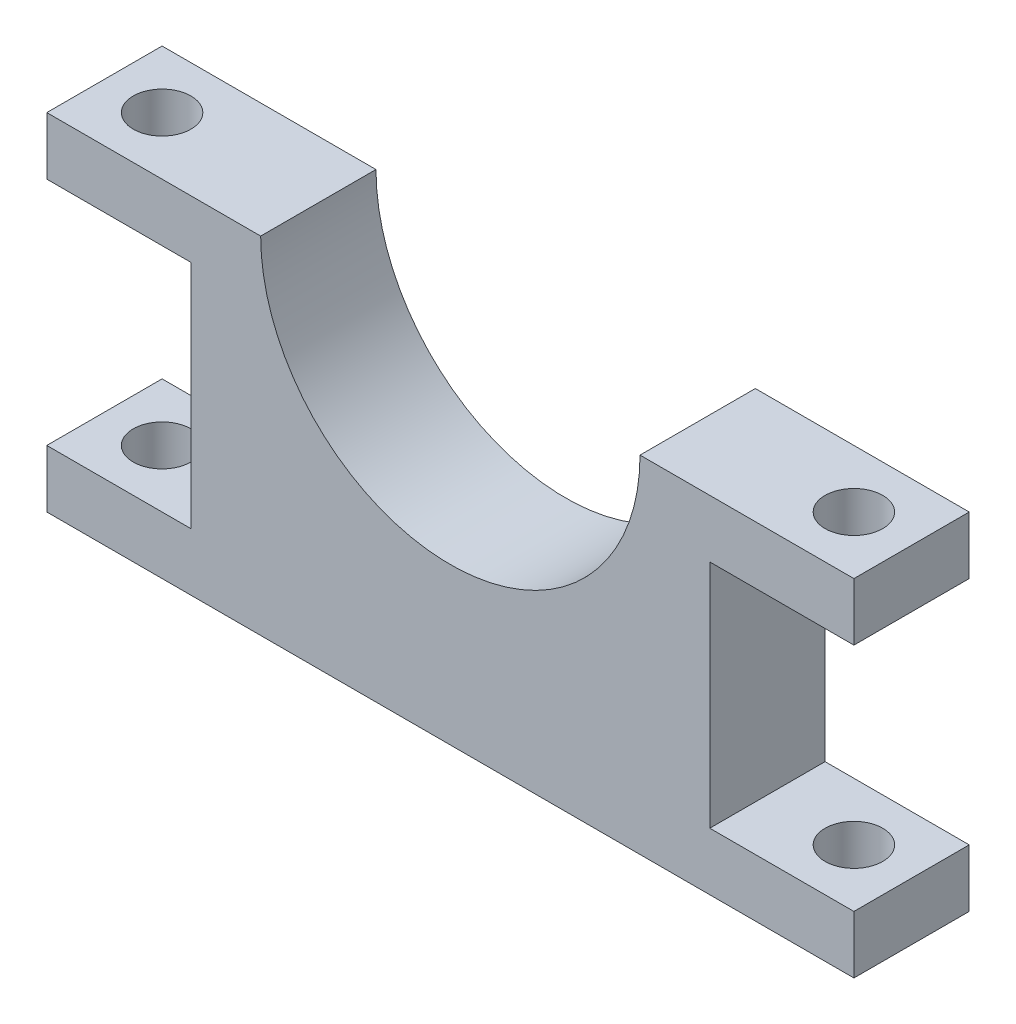
ISO-10303-21;
HEADER;
FILE_DESCRIPTION(('STEP AP214'),'2;1');
FILE_NAME('part.step','',(''),(''),'','','');
FILE_SCHEMA(('AUTOMOTIVE_DESIGN { 1 0 10303 214 1 1 1 1 }'));
ENDSEC;
DATA;
#1=APPLICATION_CONTEXT('core data for automotive mechanical design processes');
#2=APPLICATION_PROTOCOL_DEFINITION('international standard','automotive_design',2000,#1);
#3=PRODUCT_CONTEXT('',#1,'mechanical');
#4=PRODUCT('Part','Part','',(#3));
#5=PRODUCT_RELATED_PRODUCT_CATEGORY('part','',(#4));
#6=PRODUCT_DEFINITION_FORMATION('','',#4);
#7=PRODUCT_DEFINITION_CONTEXT('part definition',#1,'design');
#8=PRODUCT_DEFINITION('design','',#6,#7);
#9=PRODUCT_DEFINITION_SHAPE('','',#8);
#10=(LENGTH_UNIT() NAMED_UNIT(*) SI_UNIT(.MILLI.,.METRE.));
#11=(NAMED_UNIT(*) PLANE_ANGLE_UNIT() SI_UNIT($,.RADIAN.));
#12=(NAMED_UNIT(*) SI_UNIT($,.STERADIAN.) SOLID_ANGLE_UNIT());
#13=UNCERTAINTY_MEASURE_WITH_UNIT(LENGTH_MEASURE(1.E-05),#10,'distance_accuracy_value','');
#14=(GEOMETRIC_REPRESENTATION_CONTEXT(3) GLOBAL_UNCERTAINTY_ASSIGNED_CONTEXT((#13)) GLOBAL_UNIT_ASSIGNED_CONTEXT((#10,
#11,#12)) REPRESENTATION_CONTEXT('',''));
#15=CARTESIAN_POINT('',(0.,0.,0.));
#16=DIRECTION('',(0.,0.,1.));
#17=DIRECTION('',(1.,0.,0.));
#18=AXIS2_PLACEMENT_3D('',#15,#16,#17);
#19=CARTESIAN_POINT('',(-22.5,0.,5.));
#20=DIRECTION('',(1.,0.,0.));
#21=DIRECTION('',(0.,1.,0.));
#22=AXIS2_PLACEMENT_3D('',#19,#20,#21);
#23=PLANE('',#22);
#24=DIRECTION('',(0.,0.,-1.));
#25=VECTOR('',#24,1.);
#26=CARTESIAN_POINT('',(-22.5,-5.,-5.));
#27=LINE('',#26,#25);
#28=CARTESIAN_POINT('',(-22.5,-5.,5.));
#29=VERTEX_POINT('',#28);
#30=CARTESIAN_POINT('',(-22.5,-5.,-5.));
#31=VERTEX_POINT('',#30);
#32=EDGE_CURVE('E162',#29,#31,#27,.T.);
#33=ORIENTED_EDGE('',*,*,#32,.T.);
#34=DIRECTION('',(0.,-1.,0.));
#35=VECTOR('',#34,1.);
#36=CARTESIAN_POINT('',(-22.5,0.,-5.));
#37=LINE('',#36,#35);
#38=CARTESIAN_POINT('',(-22.5,-25.,-5.));
#39=VERTEX_POINT('',#38);
#40=EDGE_CURVE('E307',#31,#39,#37,.T.);
#41=ORIENTED_EDGE('',*,*,#40,.T.);
#42=DIRECTION('',(0.,0.,-1.));
#43=VECTOR('',#42,1.);
#44=CARTESIAN_POINT('',(-22.5,-25.,5.));
#45=LINE('',#44,#43);
#46=CARTESIAN_POINT('',(-22.5,-25.,5.));
#47=VERTEX_POINT('',#46);
#48=EDGE_CURVE('E279',#47,#39,#45,.T.);
#49=ORIENTED_EDGE('',*,*,#48,.F.);
#50=DIRECTION('',(0.,-1.,0.));
#51=VECTOR('',#50,1.);
#52=CARTESIAN_POINT('',(-22.5,0.,5.));
#53=LINE('',#52,#51);
#54=EDGE_CURVE('E55',#29,#47,#53,.T.);
#55=ORIENTED_EDGE('',*,*,#54,.F.);
#56=EDGE_LOOP('',(#33,#41,#49,#55));
#57=FACE_BOUND('',#56,.T.);
#58=ADVANCED_FACE('F39',(#57),#23,.F.);
#59=CARTESIAN_POINT('',(22.5,0.,5.));
#60=DIRECTION('',(-1.,0.,0.));
#61=DIRECTION('',(0.,-1.,0.));
#62=AXIS2_PLACEMENT_3D('',#59,#60,#61);
#63=PLANE('',#62);
#64=DIRECTION('',(0.,1.,0.));
#65=VECTOR('',#64,1.);
#66=CARTESIAN_POINT('',(22.5,0.,-5.));
#67=LINE('',#66,#65);
#68=CARTESIAN_POINT('',(22.5,-25.,-5.));
#69=VERTEX_POINT('',#68);
#70=CARTESIAN_POINT('',(22.5,-4.99999999999999,-5.));
#71=VERTEX_POINT('',#70);
#72=EDGE_CURVE('E313',#69,#71,#67,.T.);
#73=ORIENTED_EDGE('',*,*,#72,.T.);
#74=DIRECTION('',(0.,0.,1.));
#75=VECTOR('',#74,1.);
#76=CARTESIAN_POINT('',(22.5,-5.,-5.));
#77=LINE('',#76,#75);
#78=CARTESIAN_POINT('',(22.5,-4.99999999999999,5.));
#79=VERTEX_POINT('',#78);
#80=EDGE_CURVE('E63',#71,#79,#77,.T.);
#81=ORIENTED_EDGE('',*,*,#80,.T.);
#82=DIRECTION('',(0.,1.,0.));
#83=VECTOR('',#82,1.);
#84=CARTESIAN_POINT('',(22.5,0.,5.));
#85=LINE('',#84,#83);
#86=CARTESIAN_POINT('',(22.5,-25.,5.));
#87=VERTEX_POINT('',#86);
#88=EDGE_CURVE('E295',#87,#79,#85,.T.);
#89=ORIENTED_EDGE('',*,*,#88,.F.);
#90=DIRECTION('',(0.,0.,1.));
#91=VECTOR('',#90,1.);
#92=CARTESIAN_POINT('',(22.5,-25.,5.));
#93=LINE('',#92,#91);
#94=EDGE_CURVE('E264',#69,#87,#93,.T.);
#95=ORIENTED_EDGE('',*,*,#94,.F.);
#96=EDGE_LOOP('',(#73,#81,#89,#95));
#97=FACE_BOUND('',#96,.T.);
#98=ADVANCED_FACE('F342',(#97),#63,.F.);
#99=CARTESIAN_POINT('',(0.,0.,5.));
#100=DIRECTION('',(0.,0.,-1.));
#101=DIRECTION('',(-1.,0.,0.));
#102=AXIS2_PLACEMENT_3D('',#99,#100,#101);
#103=CYLINDRICAL_SURFACE('',#102,16.45);
#104=CARTESIAN_POINT('',(0.,0.,-5.));
#105=DIRECTION('',(0.,0.,-1.));
#106=DIRECTION('',(1.,0.,0.));
#107=AXIS2_PLACEMENT_3D('',#104,#105,#106);
#108=CIRCLE('',#107,16.45);
#109=CARTESIAN_POINT('',(16.45,0.,-5.));
#110=VERTEX_POINT('',#109);
#111=CARTESIAN_POINT('',(-16.45,0.,-5.));
#112=VERTEX_POINT('',#111);
#113=EDGE_CURVE('E283',#110,#112,#108,.T.);
#114=ORIENTED_EDGE('',*,*,#113,.T.);
#115=DIRECTION('',(0.,0.,-1.));
#116=VECTOR('',#115,1.);
#117=CARTESIAN_POINT('',(-16.45,0.,5.));
#118=LINE('',#117,#116);
#119=CARTESIAN_POINT('',(-16.45,0.,5.));
#120=VERTEX_POINT('',#119);
#121=EDGE_CURVE('E11',#120,#112,#118,.T.);
#122=ORIENTED_EDGE('',*,*,#121,.F.);
#123=CARTESIAN_POINT('',(0.,0.,5.));
#124=DIRECTION('',(0.,0.,-1.));
#125=DIRECTION('',(1.,0.,0.));
#126=AXIS2_PLACEMENT_3D('',#123,#124,#125);
#127=CIRCLE('',#126,16.45);
#128=CARTESIAN_POINT('',(16.45,0.,5.));
#129=VERTEX_POINT('',#128);
#130=EDGE_CURVE('E284',#129,#120,#127,.T.);
#131=ORIENTED_EDGE('',*,*,#130,.F.);
#132=DIRECTION('',(0.,0.,-1.));
#133=VECTOR('',#132,1.);
#134=CARTESIAN_POINT('',(16.45,0.,5.));
#135=LINE('',#134,#133);
#136=EDGE_CURVE('E48',#129,#110,#135,.T.);
#137=ORIENTED_EDGE('',*,*,#136,.T.);
#138=EDGE_LOOP('',(#114,#122,#131,#137));
#139=FACE_BOUND('',#138,.T.);
#140=ADVANCED_FACE('F41',(#139),#103,.F.);
#141=CARTESIAN_POINT('',(-16.45,0.,5.));
#142=DIRECTION('',(0.,-1.,0.));
#143=DIRECTION('',(1.,0.,0.));
#144=AXIS2_PLACEMENT_3D('',#141,#142,#143);
#145=PLANE('',#144);
#146=DIRECTION('',(-1.,0.,0.));
#147=VECTOR('',#146,1.);
#148=CARTESIAN_POINT('',(-16.45,0.,-5.));
#149=LINE('',#148,#147);
#150=CARTESIAN_POINT('',(-35.,0.,-5.));
#151=VERTEX_POINT('',#150);
#152=EDGE_CURVE('E304',#112,#151,#149,.T.);
#153=ORIENTED_EDGE('',*,*,#152,.T.);
#154=DIRECTION('',(0.,0.,1.));
#155=VECTOR('',#154,1.);
#156=CARTESIAN_POINT('',(-35.,0.,-5.));
#157=LINE('',#156,#155);
#158=CARTESIAN_POINT('',(-35.,0.,5.));
#159=VERTEX_POINT('',#158);
#160=EDGE_CURVE('E168',#151,#159,#157,.T.);
#161=ORIENTED_EDGE('',*,*,#160,.T.);
#162=DIRECTION('',(-1.,0.,0.));
#163=VECTOR('',#162,1.);
#164=CARTESIAN_POINT('',(-16.45,0.,5.));
#165=LINE('',#164,#163);
#166=EDGE_CURVE('E147',#120,#159,#165,.T.);
#167=ORIENTED_EDGE('',*,*,#166,.F.);
#168=ORIENTED_EDGE('',*,*,#121,.T.);
#169=EDGE_LOOP('',(#153,#161,#167,#168));
#170=FACE_BOUND('',#169,.T.);
#171=CARTESIAN_POINT('',(-30.,0.,0.));
#172=DIRECTION('',(0.,1.,0.));
#173=DIRECTION('',(-1.,0.,0.));
#174=AXIS2_PLACEMENT_3D('',#171,#172,#173);
#175=CIRCLE('',#174,2.5);
#176=CARTESIAN_POINT('',(-32.5,0.,0.));
#177=VERTEX_POINT('',#176);
#178=EDGE_CURVE('E174',#177,#177,#175,.T.);
#179=ORIENTED_EDGE('',*,*,#178,.F.);
#180=EDGE_LOOP('',(#179));
#181=FACE_BOUND('',#180,.T.);
#182=ADVANCED_FACE('F328',(#170,#181),#145,.F.);
#183=CARTESIAN_POINT('',(22.5,-30.,5.));
#184=DIRECTION('',(0.,1.,0.));
#185=DIRECTION('',(-1.,0.,0.));
#186=AXIS2_PLACEMENT_3D('',#183,#184,#185);
#187=PLANE('',#186);
#188=DIRECTION('',(1.,0.,0.));
#189=VECTOR('',#188,1.);
#190=CARTESIAN_POINT('',(22.5,-30.,-5.));
#191=LINE('',#190,#189);
#192=CARTESIAN_POINT('',(-35.,-30.,-5.));
#193=VERTEX_POINT('',#192);
#194=CARTESIAN_POINT('',(35.,-30.,-5.));
#195=VERTEX_POINT('',#194);
#196=EDGE_CURVE('E310',#193,#195,#191,.T.);
#197=ORIENTED_EDGE('',*,*,#196,.T.);
#198=DIRECTION('',(0.,0.,1.));
#199=VECTOR('',#198,1.);
#200=CARTESIAN_POINT('',(35.,-30.,5.));
#201=LINE('',#200,#199);
#202=CARTESIAN_POINT('',(35.,-30.,5.));
#203=VERTEX_POINT('',#202);
#204=EDGE_CURVE('E230',#195,#203,#201,.T.);
#205=ORIENTED_EDGE('',*,*,#204,.T.);
#206=DIRECTION('',(1.,0.,0.));
#207=VECTOR('',#206,1.);
#208=CARTESIAN_POINT('',(22.5,-30.,5.));
#209=LINE('',#208,#207);
#210=CARTESIAN_POINT('',(-35.,-30.,5.));
#211=VERTEX_POINT('',#210);
#212=EDGE_CURVE('E292',#211,#203,#209,.T.);
#213=ORIENTED_EDGE('',*,*,#212,.F.);
#214=DIRECTION('',(0.,0.,-1.));
#215=VECTOR('',#214,1.);
#216=CARTESIAN_POINT('',(-35.,-30.,5.));
#217=LINE('',#216,#215);
#218=EDGE_CURVE('E239',#211,#193,#217,.T.);
#219=ORIENTED_EDGE('',*,*,#218,.T.);
#220=EDGE_LOOP('',(#197,#205,#213,#219));
#221=FACE_BOUND('',#220,.T.);
#222=CARTESIAN_POINT('',(30.,-30.,0.));
#223=DIRECTION('',(0.,-1.,0.));
#224=DIRECTION('',(-1.,0.,0.));
#225=AXIS2_PLACEMENT_3D('',#222,#223,#224);
#226=CIRCLE('',#225,2.5);
#227=CARTESIAN_POINT('',(27.5,-30.,0.));
#228=VERTEX_POINT('',#227);
#229=EDGE_CURVE('E214',#228,#228,#226,.T.);
#230=ORIENTED_EDGE('',*,*,#229,.F.);
#231=EDGE_LOOP('',(#230));
#232=FACE_BOUND('',#231,.T.);
#233=CARTESIAN_POINT('',(-30.,-30.,0.));
#234=DIRECTION('',(0.,-1.,0.));
#235=DIRECTION('',(1.,0.,0.));
#236=AXIS2_PLACEMENT_3D('',#233,#234,#235);
#237=CIRCLE('',#236,2.5);
#238=CARTESIAN_POINT('',(-27.5,-30.,0.));
#239=VERTEX_POINT('',#238);
#240=EDGE_CURVE('E222',#239,#239,#237,.T.);
#241=ORIENTED_EDGE('',*,*,#240,.F.);
#242=EDGE_LOOP('',(#241));
#243=FACE_BOUND('',#242,.T.);
#244=ADVANCED_FACE('F360',(#221,#232,#243),#187,.F.);
#245=CARTESIAN_POINT('',(16.45,0.,5.));
#246=DIRECTION('',(0.,-1.,0.));
#247=DIRECTION('',(1.,0.,0.));
#248=AXIS2_PLACEMENT_3D('',#245,#246,#247);
#249=PLANE('',#248);
#250=DIRECTION('',(-1.,0.,0.));
#251=VECTOR('',#250,1.);
#252=CARTESIAN_POINT('',(16.45,0.,-5.));
#253=LINE('',#252,#251);
#254=CARTESIAN_POINT('',(35.,0.,-5.));
#255=VERTEX_POINT('',#254);
#256=EDGE_CURVE('E287',#255,#110,#253,.T.);
#257=ORIENTED_EDGE('',*,*,#256,.T.);
#258=ORIENTED_EDGE('',*,*,#136,.F.);
#259=DIRECTION('',(-1.,0.,0.));
#260=VECTOR('',#259,1.);
#261=CARTESIAN_POINT('',(16.45,0.,5.));
#262=LINE('',#261,#260);
#263=CARTESIAN_POINT('',(35.,0.,5.));
#264=VERTEX_POINT('',#263);
#265=EDGE_CURVE('E298',#264,#129,#262,.T.);
#266=ORIENTED_EDGE('',*,*,#265,.F.);
#267=DIRECTION('',(0.,0.,-1.));
#268=VECTOR('',#267,1.);
#269=CARTESIAN_POINT('',(35.,0.,-5.));
#270=LINE('',#269,#268);
#271=EDGE_CURVE('E188',#264,#255,#270,.T.);
#272=ORIENTED_EDGE('',*,*,#271,.T.);
#273=EDGE_LOOP('',(#257,#258,#266,#272));
#274=FACE_BOUND('',#273,.T.);
#275=CARTESIAN_POINT('',(30.,0.,0.));
#276=DIRECTION('',(0.,1.,0.));
#277=DIRECTION('',(1.,0.,0.));
#278=AXIS2_PLACEMENT_3D('',#275,#276,#277);
#279=CIRCLE('',#278,2.5);
#280=CARTESIAN_POINT('',(32.5,0.,0.));
#281=VERTEX_POINT('',#280);
#282=EDGE_CURVE('E182',#281,#281,#279,.T.);
#283=ORIENTED_EDGE('',*,*,#282,.F.);
#284=EDGE_LOOP('',(#283));
#285=FACE_BOUND('',#284,.T.);
#286=ADVANCED_FACE('F331',(#274,#285),#249,.F.);
#287=CARTESIAN_POINT('',(0.,0.,5.));
#288=DIRECTION('',(0.,0.,1.));
#289=DIRECTION('',(1.,0.,0.));
#290=AXIS2_PLACEMENT_3D('',#287,#288,#289);
#291=PLANE('',#290);
#292=ORIENTED_EDGE('',*,*,#212,.T.);
#293=DIRECTION('',(0.,-1.,0.));
#294=VECTOR('',#293,1.);
#295=CARTESIAN_POINT('',(35.,-25.,5.));
#296=LINE('',#295,#294);
#297=CARTESIAN_POINT('',(35.,-25.,5.));
#298=VERTEX_POINT('',#297);
#299=EDGE_CURVE('E253',#298,#203,#296,.T.);
#300=ORIENTED_EDGE('',*,*,#299,.F.);
#301=DIRECTION('',(-1.,0.,0.));
#302=VECTOR('',#301,1.);
#303=CARTESIAN_POINT('',(-35.,-25.,5.));
#304=LINE('',#303,#302);
#305=EDGE_CURVE('E240',#298,#87,#304,.T.);
#306=ORIENTED_EDGE('',*,*,#305,.T.);
#307=ORIENTED_EDGE('',*,*,#88,.T.);
#308=DIRECTION('',(1.,0.,0.));
#309=VECTOR('',#308,1.);
#310=CARTESIAN_POINT('',(22.5,-5.,5.));
#311=LINE('',#310,#309);
#312=CARTESIAN_POINT('',(35.,-5.,5.));
#313=VERTEX_POINT('',#312);
#314=EDGE_CURVE('E192',#79,#313,#311,.T.);
#315=ORIENTED_EDGE('',*,*,#314,.T.);
#316=DIRECTION('',(0.,1.,0.));
#317=VECTOR('',#316,1.);
#318=CARTESIAN_POINT('',(35.,-5.,5.));
#319=LINE('',#318,#317);
#320=EDGE_CURVE('E206',#313,#264,#319,.T.);
#321=ORIENTED_EDGE('',*,*,#320,.T.);
#322=ORIENTED_EDGE('',*,*,#265,.T.);
#323=ORIENTED_EDGE('',*,*,#130,.T.);
#324=ORIENTED_EDGE('',*,*,#166,.T.);
#325=DIRECTION('',(0.,1.,0.));
#326=VECTOR('',#325,1.);
#327=CARTESIAN_POINT('',(-35.,-5.,5.));
#328=LINE('',#327,#326);
#329=CARTESIAN_POINT('',(-35.,-5.,5.));
#330=VERTEX_POINT('',#329);
#331=EDGE_CURVE('E142',#330,#159,#328,.T.);
#332=ORIENTED_EDGE('',*,*,#331,.F.);
#333=DIRECTION('',(1.,0.,0.));
#334=VECTOR('',#333,1.);
#335=CARTESIAN_POINT('',(-35.,-5.,5.));
#336=LINE('',#335,#334);
#337=EDGE_CURVE('E145',#330,#29,#336,.T.);
#338=ORIENTED_EDGE('',*,*,#337,.T.);
#339=ORIENTED_EDGE('',*,*,#54,.T.);
#340=CARTESIAN_POINT('',(-35.,-25.,5.));
#341=VERTEX_POINT('',#340);
#342=EDGE_CURVE('E238',#47,#341,#304,.T.);
#343=ORIENTED_EDGE('',*,*,#342,.T.);
#344=DIRECTION('',(0.,-1.,0.));
#345=VECTOR('',#344,1.);
#346=CARTESIAN_POINT('',(-35.,-25.,5.));
#347=LINE('',#346,#345);
#348=EDGE_CURVE('E269',#341,#211,#347,.T.);
#349=ORIENTED_EDGE('',*,*,#348,.T.);
#350=EDGE_LOOP('',(#292,#300,#306,#307,#315,#321,#322,#323,#324,#332,#338,#339,#343,#349));
#351=FACE_BOUND('',#350,.T.);
#352=ADVANCED_FACE('F144',(#351),#291,.T.);
#353=CARTESIAN_POINT('',(0.,0.,-5.));
#354=DIRECTION('',(0.,0.,1.));
#355=DIRECTION('',(1.,0.,0.));
#356=AXIS2_PLACEMENT_3D('',#353,#354,#355);
#357=PLANE('',#356);
#358=ORIENTED_EDGE('',*,*,#196,.F.);
#359=DIRECTION('',(0.,-1.,0.));
#360=VECTOR('',#359,1.);
#361=CARTESIAN_POINT('',(-35.,-25.,-5.));
#362=LINE('',#361,#360);
#363=CARTESIAN_POINT('',(-35.,-25.,-5.));
#364=VERTEX_POINT('',#363);
#365=EDGE_CURVE('E265',#364,#193,#362,.T.);
#366=ORIENTED_EDGE('',*,*,#365,.F.);
#367=DIRECTION('',(1.,0.,0.));
#368=VECTOR('',#367,1.);
#369=CARTESIAN_POINT('',(-35.,-25.,-5.));
#370=LINE('',#369,#368);
#371=EDGE_CURVE('E249',#364,#39,#370,.T.);
#372=ORIENTED_EDGE('',*,*,#371,.T.);
#373=ORIENTED_EDGE('',*,*,#40,.F.);
#374=DIRECTION('',(-1.,0.,0.));
#375=VECTOR('',#374,1.);
#376=CARTESIAN_POINT('',(-35.,-5.,-5.));
#377=LINE('',#376,#375);
#378=CARTESIAN_POINT('',(-35.,-5.,-5.));
#379=VERTEX_POINT('',#378);
#380=EDGE_CURVE('E154',#31,#379,#377,.T.);
#381=ORIENTED_EDGE('',*,*,#380,.T.);
#382=DIRECTION('',(0.,1.,0.));
#383=VECTOR('',#382,1.);
#384=CARTESIAN_POINT('',(-35.,-5.,-5.));
#385=LINE('',#384,#383);
#386=EDGE_CURVE('E153',#379,#151,#385,.T.);
#387=ORIENTED_EDGE('',*,*,#386,.T.);
#388=ORIENTED_EDGE('',*,*,#152,.F.);
#389=ORIENTED_EDGE('',*,*,#113,.F.);
#390=ORIENTED_EDGE('',*,*,#256,.F.);
#391=DIRECTION('',(0.,1.,0.));
#392=VECTOR('',#391,1.);
#393=CARTESIAN_POINT('',(35.,-5.,-5.));
#394=LINE('',#393,#392);
#395=CARTESIAN_POINT('',(35.,-5.,-5.));
#396=VERTEX_POINT('',#395);
#397=EDGE_CURVE('E210',#396,#255,#394,.T.);
#398=ORIENTED_EDGE('',*,*,#397,.F.);
#399=DIRECTION('',(-1.,0.,0.));
#400=VECTOR('',#399,1.);
#401=CARTESIAN_POINT('',(22.5,-5.,-5.));
#402=LINE('',#401,#400);
#403=EDGE_CURVE('E200',#396,#71,#402,.T.);
#404=ORIENTED_EDGE('',*,*,#403,.T.);
#405=ORIENTED_EDGE('',*,*,#72,.F.);
#406=CARTESIAN_POINT('',(35.,-25.,-5.));
#407=VERTEX_POINT('',#406);
#408=EDGE_CURVE('E248',#69,#407,#370,.T.);
#409=ORIENTED_EDGE('',*,*,#408,.T.);
#410=DIRECTION('',(0.,-1.,0.));
#411=VECTOR('',#410,1.);
#412=CARTESIAN_POINT('',(35.,-25.,-5.));
#413=LINE('',#412,#411);
#414=EDGE_CURVE('E260',#407,#195,#413,.T.);
#415=ORIENTED_EDGE('',*,*,#414,.T.);
#416=EDGE_LOOP('',(#358,#366,#372,#373,#381,#387,#388,#389,#390,#398,#404,#405,#409,#415));
#417=FACE_BOUND('',#416,.T.);
#418=ADVANCED_FACE('F326',(#417),#357,.F.);
#419=CARTESIAN_POINT('',(35.,-25.,5.));
#420=DIRECTION('',(1.,0.,0.));
#421=DIRECTION('',(0.,1.,0.));
#422=AXIS2_PLACEMENT_3D('',#419,#420,#421);
#423=PLANE('',#422);
#424=ORIENTED_EDGE('',*,*,#204,.F.);
#425=ORIENTED_EDGE('',*,*,#414,.F.);
#426=DIRECTION('',(0.,0.,1.));
#427=VECTOR('',#426,1.);
#428=CARTESIAN_POINT('',(35.,-25.,5.));
#429=LINE('',#428,#427);
#430=EDGE_CURVE('E234',#407,#298,#429,.T.);
#431=ORIENTED_EDGE('',*,*,#430,.T.);
#432=ORIENTED_EDGE('',*,*,#299,.T.);
#433=EDGE_LOOP('',(#424,#425,#431,#432));
#434=FACE_BOUND('',#433,.T.);
#435=ADVANCED_FACE('F364',(#434),#423,.T.);
#436=CARTESIAN_POINT('',(30.,-25.,0.));
#437=DIRECTION('',(0.,-1.,0.));
#438=DIRECTION('',(1.,0.,0.));
#439=AXIS2_PLACEMENT_3D('',#436,#437,#438);
#440=CYLINDRICAL_SURFACE('',#439,2.5);
#441=CARTESIAN_POINT('',(30.,-25.,0.));
#442=DIRECTION('',(0.,-1.,0.));
#443=DIRECTION('',(-1.,0.,0.));
#444=AXIS2_PLACEMENT_3D('',#441,#442,#443);
#445=CIRCLE('',#444,2.5);
#446=CARTESIAN_POINT('',(27.5,-25.,0.));
#447=VERTEX_POINT('',#446);
#448=EDGE_CURVE('E218',#447,#447,#445,.T.);
#449=ORIENTED_EDGE('',*,*,#448,.F.);
#450=EDGE_LOOP('',(#449));
#451=FACE_BOUND('',#450,.T.);
#452=ORIENTED_EDGE('',*,*,#229,.T.);
#453=EDGE_LOOP('',(#452));
#454=FACE_BOUND('',#453,.T.);
#455=ADVANCED_FACE('F366',(#451,#454),#440,.F.);
#456=CARTESIAN_POINT('',(0.,-25.,0.));
#457=DIRECTION('',(0.,-1.,0.));
#458=DIRECTION('',(1.,0.,0.));
#459=AXIS2_PLACEMENT_3D('',#456,#457,#458);
#460=PLANE('',#459);
#461=ORIENTED_EDGE('',*,*,#448,.T.);
#462=EDGE_LOOP('',(#461));
#463=FACE_BOUND('',#462,.T.);
#464=ORIENTED_EDGE('',*,*,#408,.F.);
#465=ORIENTED_EDGE('',*,*,#94,.T.);
#466=ORIENTED_EDGE('',*,*,#305,.F.);
#467=ORIENTED_EDGE('',*,*,#430,.F.);
#468=EDGE_LOOP('',(#464,#465,#466,#467));
#469=FACE_BOUND('',#468,.T.);
#470=ADVANCED_FACE('F345',(#463,#469),#460,.F.);
#471=CARTESIAN_POINT('',(-30.,-25.,0.));
#472=DIRECTION('',(0.,-1.,0.));
#473=DIRECTION('',(1.,0.,0.));
#474=AXIS2_PLACEMENT_3D('',#471,#472,#473);
#475=CIRCLE('',#474,2.5);
#476=CARTESIAN_POINT('',(-27.5,-25.,0.));
#477=VERTEX_POINT('',#476);
#478=EDGE_CURVE('E226',#477,#477,#475,.T.);
#479=ORIENTED_EDGE('',*,*,#478,.T.);
#480=EDGE_LOOP('',(#479));
#481=FACE_BOUND('',#480,.T.);
#482=ORIENTED_EDGE('',*,*,#342,.F.);
#483=ORIENTED_EDGE('',*,*,#48,.T.);
#484=ORIENTED_EDGE('',*,*,#371,.F.);
#485=DIRECTION('',(0.,0.,-1.));
#486=VECTOR('',#485,1.);
#487=CARTESIAN_POINT('',(-35.,-25.,5.));
#488=LINE('',#487,#486);
#489=EDGE_CURVE('E244',#341,#364,#488,.T.);
#490=ORIENTED_EDGE('',*,*,#489,.F.);
#491=EDGE_LOOP('',(#482,#483,#484,#490));
#492=FACE_BOUND('',#491,.T.);
#493=ADVANCED_FACE('F358',(#481,#492),#460,.F.);
#494=CARTESIAN_POINT('',(-35.,-25.,5.));
#495=DIRECTION('',(-1.,0.,0.));
#496=DIRECTION('',(0.,-1.,0.));
#497=AXIS2_PLACEMENT_3D('',#494,#495,#496);
#498=PLANE('',#497);
#499=ORIENTED_EDGE('',*,*,#218,.F.);
#500=ORIENTED_EDGE('',*,*,#348,.F.);
#501=ORIENTED_EDGE('',*,*,#489,.T.);
#502=ORIENTED_EDGE('',*,*,#365,.T.);
#503=EDGE_LOOP('',(#499,#500,#501,#502));
#504=FACE_BOUND('',#503,.T.);
#505=ADVANCED_FACE('F356',(#504),#498,.T.);
#506=CARTESIAN_POINT('',(-30.,-25.,0.));
#507=DIRECTION('',(0.,-1.,0.));
#508=DIRECTION('',(1.,0.,0.));
#509=AXIS2_PLACEMENT_3D('',#506,#507,#508);
#510=CYLINDRICAL_SURFACE('',#509,2.5);
#511=ORIENTED_EDGE('',*,*,#478,.F.);
#512=EDGE_LOOP('',(#511));
#513=FACE_BOUND('',#512,.T.);
#514=ORIENTED_EDGE('',*,*,#240,.T.);
#515=EDGE_LOOP('',(#514));
#516=FACE_BOUND('',#515,.T.);
#517=ADVANCED_FACE('F439',(#513,#516),#510,.F.);
#518=CARTESIAN_POINT('',(35.,-5.,-5.));
#519=DIRECTION('',(1.,0.,0.));
#520=DIRECTION('',(0.,1.,0.));
#521=AXIS2_PLACEMENT_3D('',#518,#519,#520);
#522=PLANE('',#521);
#523=ORIENTED_EDGE('',*,*,#271,.F.);
#524=ORIENTED_EDGE('',*,*,#320,.F.);
#525=DIRECTION('',(0.,0.,-1.));
#526=VECTOR('',#525,1.);
#527=CARTESIAN_POINT('',(35.,-5.,-5.));
#528=LINE('',#527,#526);
#529=EDGE_CURVE('E196',#313,#396,#528,.T.);
#530=ORIENTED_EDGE('',*,*,#529,.T.);
#531=ORIENTED_EDGE('',*,*,#397,.T.);
#532=EDGE_LOOP('',(#523,#524,#530,#531));
#533=FACE_BOUND('',#532,.T.);
#534=ADVANCED_FACE('F334',(#533),#522,.T.);
#535=CARTESIAN_POINT('',(0.,-5.,0.));
#536=DIRECTION('',(0.,-1.,0.));
#537=DIRECTION('',(1.,0.,0.));
#538=AXIS2_PLACEMENT_3D('',#535,#536,#537);
#539=PLANE('',#538);
#540=CARTESIAN_POINT('',(30.,-5.,0.));
#541=DIRECTION('',(0.,1.,0.));
#542=DIRECTION('',(1.,0.,0.));
#543=AXIS2_PLACEMENT_3D('',#540,#541,#542);
#544=CIRCLE('',#543,2.5);
#545=CARTESIAN_POINT('',(32.5,-5.,0.));
#546=VERTEX_POINT('',#545);
#547=EDGE_CURVE('E184',#546,#546,#544,.T.);
#548=ORIENTED_EDGE('',*,*,#547,.T.);
#549=EDGE_LOOP('',(#548));
#550=FACE_BOUND('',#549,.T.);
#551=ORIENTED_EDGE('',*,*,#314,.F.);
#552=ORIENTED_EDGE('',*,*,#80,.F.);
#553=ORIENTED_EDGE('',*,*,#403,.F.);
#554=ORIENTED_EDGE('',*,*,#529,.F.);
#555=EDGE_LOOP('',(#551,#552,#553,#554));
#556=FACE_BOUND('',#555,.T.);
#557=ADVANCED_FACE('F340',(#550,#556),#539,.T.);
#558=CARTESIAN_POINT('',(30.,-5.,0.));
#559=DIRECTION('',(0.,1.,0.));
#560=DIRECTION('',(-1.,0.,0.));
#561=AXIS2_PLACEMENT_3D('',#558,#559,#560);
#562=CYLINDRICAL_SURFACE('',#561,2.5);
#563=ORIENTED_EDGE('',*,*,#547,.F.);
#564=EDGE_LOOP('',(#563));
#565=FACE_BOUND('',#564,.T.);
#566=ORIENTED_EDGE('',*,*,#282,.T.);
#567=EDGE_LOOP('',(#566));
#568=FACE_BOUND('',#567,.T.);
#569=ADVANCED_FACE('F449',(#565,#568),#562,.F.);
#570=CARTESIAN_POINT('',(-35.,-5.,-5.));
#571=DIRECTION('',(-1.,0.,0.));
#572=DIRECTION('',(0.,-1.,0.));
#573=AXIS2_PLACEMENT_3D('',#570,#571,#572);
#574=PLANE('',#573);
#575=ORIENTED_EDGE('',*,*,#160,.F.);
#576=ORIENTED_EDGE('',*,*,#386,.F.);
#577=DIRECTION('',(0.,0.,1.));
#578=VECTOR('',#577,1.);
#579=CARTESIAN_POINT('',(-35.,-5.,-5.));
#580=LINE('',#579,#578);
#581=EDGE_CURVE('E160',#379,#330,#580,.T.);
#582=ORIENTED_EDGE('',*,*,#581,.T.);
#583=ORIENTED_EDGE('',*,*,#331,.T.);
#584=EDGE_LOOP('',(#575,#576,#582,#583));
#585=FACE_BOUND('',#584,.T.);
#586=ADVANCED_FACE('F165',(#585),#574,.T.);
#587=CARTESIAN_POINT('',(0.,-5.,0.));
#588=DIRECTION('',(0.,1.,0.));
#589=DIRECTION('',(-1.,0.,0.));
#590=AXIS2_PLACEMENT_3D('',#587,#588,#589);
#591=PLANE('',#590);
#592=CARTESIAN_POINT('',(-30.,-5.,0.));
#593=DIRECTION('',(0.,1.,0.));
#594=DIRECTION('',(-1.,0.,0.));
#595=AXIS2_PLACEMENT_3D('',#592,#593,#594);
#596=CIRCLE('',#595,2.5);
#597=CARTESIAN_POINT('',(-32.5,-5.,0.));
#598=VERTEX_POINT('',#597);
#599=EDGE_CURVE('E171',#598,#598,#596,.T.);
#600=ORIENTED_EDGE('',*,*,#599,.T.);
#601=EDGE_LOOP('',(#600));
#602=FACE_BOUND('',#601,.T.);
#603=ORIENTED_EDGE('',*,*,#581,.F.);
#604=ORIENTED_EDGE('',*,*,#380,.F.);
#605=ORIENTED_EDGE('',*,*,#32,.F.);
#606=ORIENTED_EDGE('',*,*,#337,.F.);
#607=EDGE_LOOP('',(#603,#604,#605,#606));
#608=FACE_BOUND('',#607,.T.);
#609=ADVANCED_FACE('F158',(#602,#608),#591,.F.);
#610=CARTESIAN_POINT('',(-30.,-5.,0.));
#611=DIRECTION('',(0.,1.,0.));
#612=DIRECTION('',(-1.,0.,0.));
#613=AXIS2_PLACEMENT_3D('',#610,#611,#612);
#614=CYLINDRICAL_SURFACE('',#613,2.5);
#615=ORIENTED_EDGE('',*,*,#599,.F.);
#616=EDGE_LOOP('',(#615));
#617=FACE_BOUND('',#616,.T.);
#618=ORIENTED_EDGE('',*,*,#178,.T.);
#619=EDGE_LOOP('',(#618));
#620=FACE_BOUND('',#619,.T.);
#621=ADVANCED_FACE('F476',(#617,#620),#614,.F.);
#622=CLOSED_SHELL('',(#58,#98,#140,#182,#244,#286,#352,#418,#435,#455,#470,#493,#505,#517,#534,
#557,#569,#586,#609,#621));
#623=MANIFOLD_SOLID_BREP('B2',#622);
#624=ADVANCED_BREP_SHAPE_REPRESENTATION('',(#18,#623),#14);
#625=SHAPE_DEFINITION_REPRESENTATION(#9,#624);
ENDSEC;
END-ISO-10303-21;
